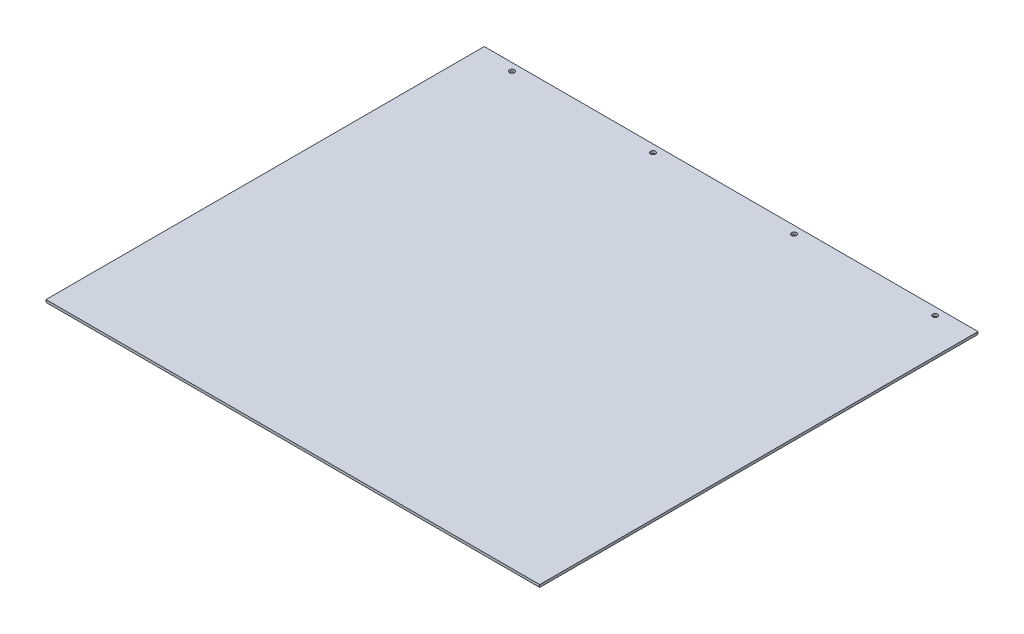
ISO-10303-21;
HEADER;
FILE_DESCRIPTION(('STEP AP214'),'2;1');
FILE_NAME('part.step','',(''),(''),'','','');
FILE_SCHEMA(('AUTOMOTIVE_DESIGN { 1 0 10303 214 1 1 1 1 }'));
ENDSEC;
DATA;
#1=APPLICATION_CONTEXT('core data for automotive mechanical design processes');
#2=APPLICATION_PROTOCOL_DEFINITION('international standard','automotive_design',2000,#1);
#3=PRODUCT_CONTEXT('',#1,'mechanical');
#4=PRODUCT('Part','Part','',(#3));
#5=PRODUCT_RELATED_PRODUCT_CATEGORY('part','',(#4));
#6=PRODUCT_DEFINITION_FORMATION('','',#4);
#7=PRODUCT_DEFINITION_CONTEXT('part definition',#1,'design');
#8=PRODUCT_DEFINITION('design','',#6,#7);
#9=PRODUCT_DEFINITION_SHAPE('','',#8);
#10=(LENGTH_UNIT() NAMED_UNIT(*) SI_UNIT(.MILLI.,.METRE.));
#11=(NAMED_UNIT(*) PLANE_ANGLE_UNIT() SI_UNIT($,.RADIAN.));
#12=(NAMED_UNIT(*) SI_UNIT($,.STERADIAN.) SOLID_ANGLE_UNIT());
#13=UNCERTAINTY_MEASURE_WITH_UNIT(LENGTH_MEASURE(1.E-05),#10,'distance_accuracy_value','');
#14=(GEOMETRIC_REPRESENTATION_CONTEXT(3) GLOBAL_UNCERTAINTY_ASSIGNED_CONTEXT((#13)) GLOBAL_UNIT_ASSIGNED_CONTEXT((#10,
#11,#12)) REPRESENTATION_CONTEXT('',''));
#15=CARTESIAN_POINT('',(0.,0.,0.));
#16=DIRECTION('',(0.,0.,1.));
#17=DIRECTION('',(1.,0.,0.));
#18=AXIS2_PLACEMENT_3D('',#15,#16,#17);
#19=CARTESIAN_POINT('',(0.,3.175,0.));
#20=DIRECTION('',(0.,-1.,0.));
#21=DIRECTION('',(0.,0.,-1.));
#22=AXIS2_PLACEMENT_3D('',#19,#20,#21);
#23=PLANE('',#22);
#24=DIRECTION('',(0.,0.,1.));
#25=VECTOR('',#24,1.);
#26=CARTESIAN_POINT('',(0.,3.175,0.));
#27=LINE('',#26,#25);
#28=CARTESIAN_POINT('',(0.,3.175,-552.45));
#29=VERTEX_POINT('',#28);
#30=CARTESIAN_POINT('',(0.,3.175,0.));
#31=VERTEX_POINT('',#30);
#32=EDGE_CURVE('E85',#29,#31,#27,.T.);
#33=ORIENTED_EDGE('',*,*,#32,.T.);
#34=DIRECTION('',(1.,0.,0.));
#35=VECTOR('',#34,1.);
#36=CARTESIAN_POINT('',(0.,3.175,0.));
#37=LINE('',#36,#35);
#38=CARTESIAN_POINT('',(622.3,3.175,0.));
#39=VERTEX_POINT('',#38);
#40=EDGE_CURVE('E80',#31,#39,#37,.T.);
#41=ORIENTED_EDGE('',*,*,#40,.T.);
#42=DIRECTION('',(0.,0.,-1.));
#43=VECTOR('',#42,1.);
#44=CARTESIAN_POINT('',(622.3,3.175,0.));
#45=LINE('',#44,#43);
#46=CARTESIAN_POINT('',(622.3,3.175,-552.45));
#47=VERTEX_POINT('',#46);
#48=EDGE_CURVE('E83',#39,#47,#45,.T.);
#49=ORIENTED_EDGE('',*,*,#48,.T.);
#50=DIRECTION('',(-1.,0.,0.));
#51=VECTOR('',#50,1.);
#52=CARTESIAN_POINT('',(0.,3.175,-552.45));
#53=LINE('',#52,#51);
#54=EDGE_CURVE('E50',#47,#29,#53,.T.);
#55=ORIENTED_EDGE('',*,*,#54,.T.);
#56=EDGE_LOOP('',(#33,#41,#49,#55));
#57=FACE_BOUND('',#56,.T.);
#58=CARTESIAN_POINT('',(44.45,3.175,-542.925));
#59=DIRECTION('',(0.,1.,0.));
#60=DIRECTION('',(0.,0.,1.));
#61=AXIS2_PLACEMENT_3D('',#58,#59,#60);
#62=CIRCLE('',#61,3.175);
#63=CARTESIAN_POINT('',(44.45,3.175,-539.75));
#64=VERTEX_POINT('',#63);
#65=EDGE_CURVE('E100',#64,#64,#62,.T.);
#66=ORIENTED_EDGE('',*,*,#65,.F.);
#67=EDGE_LOOP('',(#66));
#68=FACE_BOUND('',#67,.T.);
#69=CARTESIAN_POINT('',(222.25,3.175,-542.925));
#70=DIRECTION('',(0.,1.,0.));
#71=DIRECTION('',(0.,0.,1.));
#72=AXIS2_PLACEMENT_3D('',#69,#70,#71);
#73=CIRCLE('',#72,3.17499999999997);
#74=CARTESIAN_POINT('',(222.25,3.175,-539.75));
#75=VERTEX_POINT('',#74);
#76=EDGE_CURVE('E115',#75,#75,#73,.T.);
#77=ORIENTED_EDGE('',*,*,#76,.F.);
#78=EDGE_LOOP('',(#77));
#79=FACE_BOUND('',#78,.T.);
#80=CARTESIAN_POINT('',(577.85,3.175,-542.925));
#81=DIRECTION('',(0.,1.,0.));
#82=DIRECTION('',(0.,0.,1.));
#83=AXIS2_PLACEMENT_3D('',#80,#81,#82);
#84=CIRCLE('',#83,3.17500000000008);
#85=CARTESIAN_POINT('',(577.85,3.175,-539.75));
#86=VERTEX_POINT('',#85);
#87=EDGE_CURVE('E121',#86,#86,#84,.T.);
#88=ORIENTED_EDGE('',*,*,#87,.F.);
#89=EDGE_LOOP('',(#88));
#90=FACE_BOUND('',#89,.T.);
#91=CARTESIAN_POINT('',(400.05,3.175,-542.925));
#92=DIRECTION('',(0.,1.,0.));
#93=DIRECTION('',(0.,0.,1.));
#94=AXIS2_PLACEMENT_3D('',#91,#92,#93);
#95=CIRCLE('',#94,3.17499999999997);
#96=CARTESIAN_POINT('',(400.05,3.175,-539.75));
#97=VERTEX_POINT('',#96);
#98=EDGE_CURVE('E127',#97,#97,#95,.T.);
#99=ORIENTED_EDGE('',*,*,#98,.F.);
#100=EDGE_LOOP('',(#99));
#101=FACE_BOUND('',#100,.T.);
#102=ADVANCED_FACE('F33',(#57,#68,#79,#90,#101),#23,.F.);
#103=CARTESIAN_POINT('',(0.,0.,0.));
#104=DIRECTION('',(0.,-1.,0.));
#105=DIRECTION('',(0.,0.,-1.));
#106=AXIS2_PLACEMENT_3D('',#103,#104,#105);
#107=PLANE('',#106);
#108=CARTESIAN_POINT('',(577.85,0.,-542.925));
#109=DIRECTION('',(0.,1.,0.));
#110=DIRECTION('',(0.,0.,1.));
#111=AXIS2_PLACEMENT_3D('',#108,#109,#110);
#112=CIRCLE('',#111,3.17500000000008);
#113=CARTESIAN_POINT('',(577.85,0.,-539.75));
#114=VERTEX_POINT('',#113);
#115=EDGE_CURVE('E124',#114,#114,#112,.T.);
#116=ORIENTED_EDGE('',*,*,#115,.T.);
#117=EDGE_LOOP('',(#116));
#118=FACE_BOUND('',#117,.T.);
#119=CARTESIAN_POINT('',(44.45,0.,-542.925));
#120=DIRECTION('',(0.,1.,0.));
#121=DIRECTION('',(0.,0.,1.));
#122=AXIS2_PLACEMENT_3D('',#119,#120,#121);
#123=CIRCLE('',#122,3.175);
#124=CARTESIAN_POINT('',(44.45,0.,-539.75));
#125=VERTEX_POINT('',#124);
#126=EDGE_CURVE('E112',#125,#125,#123,.T.);
#127=ORIENTED_EDGE('',*,*,#126,.T.);
#128=EDGE_LOOP('',(#127));
#129=FACE_BOUND('',#128,.T.);
#130=DIRECTION('',(0.,0.,1.));
#131=VECTOR('',#130,1.);
#132=CARTESIAN_POINT('',(0.,0.,0.));
#133=LINE('',#132,#131);
#134=CARTESIAN_POINT('',(0.,0.,-552.45));
#135=VERTEX_POINT('',#134);
#136=CARTESIAN_POINT('',(0.,0.,0.));
#137=VERTEX_POINT('',#136);
#138=EDGE_CURVE('E97',#135,#137,#133,.T.);
#139=ORIENTED_EDGE('',*,*,#138,.F.);
#140=DIRECTION('',(-1.,0.,0.));
#141=VECTOR('',#140,1.);
#142=CARTESIAN_POINT('',(0.,0.,-552.45));
#143=LINE('',#142,#141);
#144=CARTESIAN_POINT('',(622.3,0.,-552.45));
#145=VERTEX_POINT('',#144);
#146=EDGE_CURVE('E73',#145,#135,#143,.T.);
#147=ORIENTED_EDGE('',*,*,#146,.F.);
#148=DIRECTION('',(0.,0.,-1.));
#149=VECTOR('',#148,1.);
#150=CARTESIAN_POINT('',(622.3,0.,0.));
#151=LINE('',#150,#149);
#152=CARTESIAN_POINT('',(622.3,0.,0.));
#153=VERTEX_POINT('',#152);
#154=EDGE_CURVE('E67',#153,#145,#151,.T.);
#155=ORIENTED_EDGE('',*,*,#154,.F.);
#156=DIRECTION('',(1.,0.,0.));
#157=VECTOR('',#156,1.);
#158=CARTESIAN_POINT('',(0.,0.,0.));
#159=LINE('',#158,#157);
#160=EDGE_CURVE('E89',#137,#153,#159,.T.);
#161=ORIENTED_EDGE('',*,*,#160,.F.);
#162=EDGE_LOOP('',(#139,#147,#155,#161));
#163=FACE_BOUND('',#162,.T.);
#164=CARTESIAN_POINT('',(222.25,0.,-542.925));
#165=DIRECTION('',(0.,1.,0.));
#166=DIRECTION('',(0.,0.,1.));
#167=AXIS2_PLACEMENT_3D('',#164,#165,#166);
#168=CIRCLE('',#167,3.17499999999997);
#169=CARTESIAN_POINT('',(222.25,0.,-539.75));
#170=VERTEX_POINT('',#169);
#171=EDGE_CURVE('E118',#170,#170,#168,.T.);
#172=ORIENTED_EDGE('',*,*,#171,.T.);
#173=EDGE_LOOP('',(#172));
#174=FACE_BOUND('',#173,.T.);
#175=CARTESIAN_POINT('',(400.05,0.,-542.925));
#176=DIRECTION('',(0.,1.,0.));
#177=DIRECTION('',(0.,0.,1.));
#178=AXIS2_PLACEMENT_3D('',#175,#176,#177);
#179=CIRCLE('',#178,3.17499999999997);
#180=CARTESIAN_POINT('',(400.05,0.,-539.75));
#181=VERTEX_POINT('',#180);
#182=EDGE_CURVE('E130',#181,#181,#179,.T.);
#183=ORIENTED_EDGE('',*,*,#182,.T.);
#184=EDGE_LOOP('',(#183));
#185=FACE_BOUND('',#184,.T.);
#186=ADVANCED_FACE('F108',(#118,#129,#163,#174,#185),#107,.T.);
#187=CARTESIAN_POINT('',(0.,3.175,0.));
#188=DIRECTION('',(1.,0.,0.));
#189=DIRECTION('',(0.,0.,-1.));
#190=AXIS2_PLACEMENT_3D('',#187,#188,#189);
#191=PLANE('',#190);
#192=ORIENTED_EDGE('',*,*,#138,.T.);
#193=DIRECTION('',(0.,-1.,0.));
#194=VECTOR('',#193,1.);
#195=CARTESIAN_POINT('',(0.,3.175,0.));
#196=LINE('',#195,#194);
#197=EDGE_CURVE('E11',#31,#137,#196,.T.);
#198=ORIENTED_EDGE('',*,*,#197,.F.);
#199=ORIENTED_EDGE('',*,*,#32,.F.);
#200=DIRECTION('',(0.,-1.,0.));
#201=VECTOR('',#200,1.);
#202=CARTESIAN_POINT('',(0.,3.175,-552.45));
#203=LINE('',#202,#201);
#204=EDGE_CURVE('E93',#29,#135,#203,.T.);
#205=ORIENTED_EDGE('',*,*,#204,.T.);
#206=EDGE_LOOP('',(#192,#198,#199,#205));
#207=FACE_BOUND('',#206,.T.);
#208=ADVANCED_FACE('F35',(#207),#191,.F.);
#209=CARTESIAN_POINT('',(0.,3.175,0.));
#210=DIRECTION('',(0.,0.,-1.));
#211=DIRECTION('',(-1.,0.,0.));
#212=AXIS2_PLACEMENT_3D('',#209,#210,#211);
#213=PLANE('',#212);
#214=ORIENTED_EDGE('',*,*,#160,.T.);
#215=DIRECTION('',(0.,-1.,0.));
#216=VECTOR('',#215,1.);
#217=CARTESIAN_POINT('',(622.3,3.175,0.));
#218=LINE('',#217,#216);
#219=EDGE_CURVE('E42',#39,#153,#218,.T.);
#220=ORIENTED_EDGE('',*,*,#219,.F.);
#221=ORIENTED_EDGE('',*,*,#40,.F.);
#222=ORIENTED_EDGE('',*,*,#197,.T.);
#223=EDGE_LOOP('',(#214,#220,#221,#222));
#224=FACE_BOUND('',#223,.T.);
#225=ADVANCED_FACE('F88',(#224),#213,.F.);
#226=CARTESIAN_POINT('',(622.3,3.175,0.));
#227=DIRECTION('',(-1.,0.,0.));
#228=DIRECTION('',(0.,0.,1.));
#229=AXIS2_PLACEMENT_3D('',#226,#227,#228);
#230=PLANE('',#229);
#231=ORIENTED_EDGE('',*,*,#154,.T.);
#232=DIRECTION('',(0.,-1.,0.));
#233=VECTOR('',#232,1.);
#234=CARTESIAN_POINT('',(622.3,3.175,-552.45));
#235=LINE('',#234,#233);
#236=EDGE_CURVE('E90',#47,#145,#235,.T.);
#237=ORIENTED_EDGE('',*,*,#236,.F.);
#238=ORIENTED_EDGE('',*,*,#48,.F.);
#239=ORIENTED_EDGE('',*,*,#219,.T.);
#240=EDGE_LOOP('',(#231,#237,#238,#239));
#241=FACE_BOUND('',#240,.T.);
#242=ADVANCED_FACE('F91',(#241),#230,.F.);
#243=CARTESIAN_POINT('',(0.,3.175,-552.45));
#244=DIRECTION('',(0.,0.,1.));
#245=DIRECTION('',(1.,0.,0.));
#246=AXIS2_PLACEMENT_3D('',#243,#244,#245);
#247=PLANE('',#246);
#248=ORIENTED_EDGE('',*,*,#146,.T.);
#249=ORIENTED_EDGE('',*,*,#204,.F.);
#250=ORIENTED_EDGE('',*,*,#54,.F.);
#251=ORIENTED_EDGE('',*,*,#236,.T.);
#252=EDGE_LOOP('',(#248,#249,#250,#251));
#253=FACE_BOUND('',#252,.T.);
#254=ADVANCED_FACE('F105',(#253),#247,.F.);
#255=CARTESIAN_POINT('',(44.45,3.175,-542.925));
#256=DIRECTION('',(0.,-1.,0.));
#257=DIRECTION('',(0.,0.,-1.));
#258=AXIS2_PLACEMENT_3D('',#255,#256,#257);
#259=CYLINDRICAL_SURFACE('',#258,3.175);
#260=ORIENTED_EDGE('',*,*,#65,.T.);
#261=EDGE_LOOP('',(#260));
#262=FACE_BOUND('',#261,.T.);
#263=ORIENTED_EDGE('',*,*,#126,.F.);
#264=EDGE_LOOP('',(#263));
#265=FACE_BOUND('',#264,.T.);
#266=ADVANCED_FACE('F147',(#262,#265),#259,.F.);
#267=CARTESIAN_POINT('',(222.25,3.175,-542.925));
#268=DIRECTION('',(0.,-1.,0.));
#269=DIRECTION('',(0.,0.,-1.));
#270=AXIS2_PLACEMENT_3D('',#267,#268,#269);
#271=CYLINDRICAL_SURFACE('',#270,3.17499999999997);
#272=ORIENTED_EDGE('',*,*,#76,.T.);
#273=EDGE_LOOP('',(#272));
#274=FACE_BOUND('',#273,.T.);
#275=ORIENTED_EDGE('',*,*,#171,.F.);
#276=EDGE_LOOP('',(#275));
#277=FACE_BOUND('',#276,.T.);
#278=ADVANCED_FACE('F193',(#274,#277),#271,.F.);
#279=CARTESIAN_POINT('',(577.85,3.175,-542.925));
#280=DIRECTION('',(0.,-1.,0.));
#281=DIRECTION('',(0.,0.,-1.));
#282=AXIS2_PLACEMENT_3D('',#279,#280,#281);
#283=CYLINDRICAL_SURFACE('',#282,3.17500000000008);
#284=ORIENTED_EDGE('',*,*,#87,.T.);
#285=EDGE_LOOP('',(#284));
#286=FACE_BOUND('',#285,.T.);
#287=ORIENTED_EDGE('',*,*,#115,.F.);
#288=EDGE_LOOP('',(#287));
#289=FACE_BOUND('',#288,.T.);
#290=ADVANCED_FACE('F201',(#286,#289),#283,.F.);
#291=CARTESIAN_POINT('',(400.05,3.175,-542.925));
#292=DIRECTION('',(0.,-1.,0.));
#293=DIRECTION('',(0.,0.,-1.));
#294=AXIS2_PLACEMENT_3D('',#291,#292,#293);
#295=CYLINDRICAL_SURFACE('',#294,3.17499999999997);
#296=ORIENTED_EDGE('',*,*,#98,.T.);
#297=EDGE_LOOP('',(#296));
#298=FACE_BOUND('',#297,.T.);
#299=ORIENTED_EDGE('',*,*,#182,.F.);
#300=EDGE_LOOP('',(#299));
#301=FACE_BOUND('',#300,.T.);
#302=ADVANCED_FACE('F136',(#298,#301),#295,.F.);
#303=CLOSED_SHELL('',(#102,#186,#208,#225,#242,#254,#266,#278,#290,#302));
#304=MANIFOLD_SOLID_BREP('B2',#303);
#305=ADVANCED_BREP_SHAPE_REPRESENTATION('',(#18,#304),#14);
#306=SHAPE_DEFINITION_REPRESENTATION(#9,#305);
ENDSEC;
END-ISO-10303-21;
